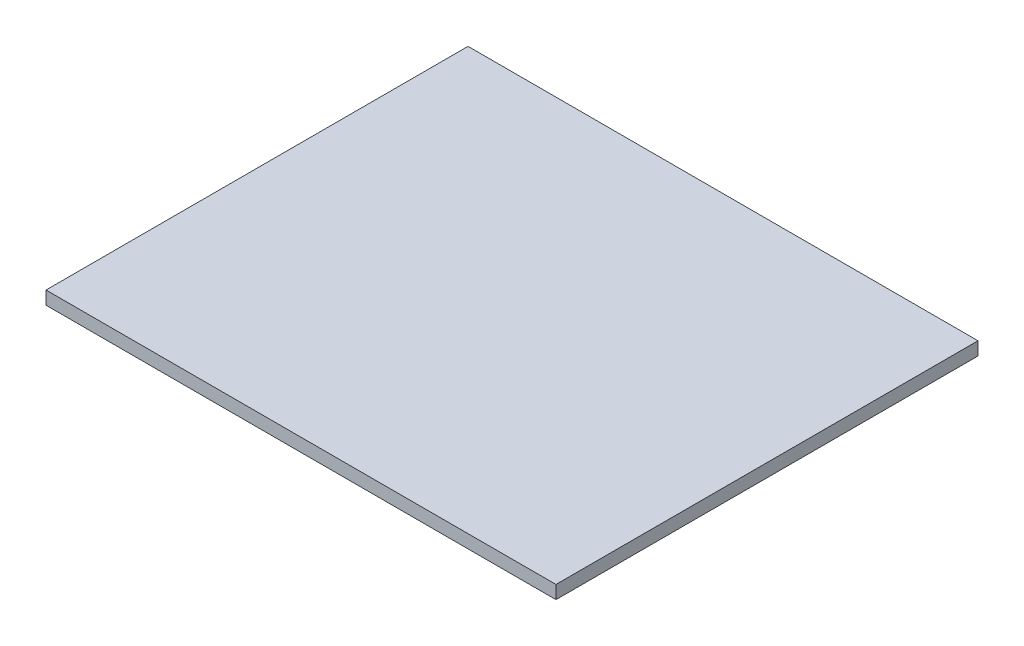
ISO-10303-21;
HEADER;
FILE_DESCRIPTION(('STEP AP214'),'2;1');
FILE_NAME('part.step','',(''),(''),'','','');
FILE_SCHEMA(('AUTOMOTIVE_DESIGN { 1 0 10303 214 1 1 1 1 }'));
ENDSEC;
DATA;
#1=APPLICATION_CONTEXT('core data for automotive mechanical design processes');
#2=APPLICATION_PROTOCOL_DEFINITION('international standard','automotive_design',2000,#1);
#3=PRODUCT_CONTEXT('',#1,'mechanical');
#4=PRODUCT('Part','Part','',(#3));
#5=PRODUCT_RELATED_PRODUCT_CATEGORY('part','',(#4));
#6=PRODUCT_DEFINITION_FORMATION('','',#4);
#7=PRODUCT_DEFINITION_CONTEXT('part definition',#1,'design');
#8=PRODUCT_DEFINITION('design','',#6,#7);
#9=PRODUCT_DEFINITION_SHAPE('','',#8);
#10=(LENGTH_UNIT() NAMED_UNIT(*) SI_UNIT(.MILLI.,.METRE.));
#11=(NAMED_UNIT(*) PLANE_ANGLE_UNIT() SI_UNIT($,.RADIAN.));
#12=(NAMED_UNIT(*) SI_UNIT($,.STERADIAN.) SOLID_ANGLE_UNIT());
#13=UNCERTAINTY_MEASURE_WITH_UNIT(LENGTH_MEASURE(1.E-05),#10,'distance_accuracy_value','');
#14=(GEOMETRIC_REPRESENTATION_CONTEXT(3) GLOBAL_UNCERTAINTY_ASSIGNED_CONTEXT((#13)) GLOBAL_UNIT_ASSIGNED_CONTEXT((#10,
#11,#12)) REPRESENTATION_CONTEXT('',''));
#15=CARTESIAN_POINT('',(0.,0.,0.));
#16=DIRECTION('',(0.,0.,1.));
#17=DIRECTION('',(1.,0.,0.));
#18=AXIS2_PLACEMENT_3D('',#15,#16,#17);
#19=CARTESIAN_POINT('',(0.,19.05,0.));
#20=DIRECTION('',(0.,0.,-1.));
#21=DIRECTION('',(-1.,0.,0.));
#22=AXIS2_PLACEMENT_3D('',#19,#20,#21);
#23=PLANE('',#22);
#24=DIRECTION('',(1.,0.,0.));
#25=VECTOR('',#24,1.);
#26=CARTESIAN_POINT('',(0.,0.,0.));
#27=LINE('',#26,#25);
#28=CARTESIAN_POINT('',(0.,0.,0.));
#29=VERTEX_POINT('',#28);
#30=CARTESIAN_POINT('',(736.6,0.,0.));
#31=VERTEX_POINT('',#30);
#32=EDGE_CURVE('E96',#29,#31,#27,.T.);
#33=ORIENTED_EDGE('',*,*,#32,.T.);
#34=DIRECTION('',(0.,-1.,0.));
#35=VECTOR('',#34,1.);
#36=CARTESIAN_POINT('',(736.6,19.05,0.));
#37=LINE('',#36,#35);
#38=CARTESIAN_POINT('',(736.6,19.05,0.));
#39=VERTEX_POINT('',#38);
#40=EDGE_CURVE('E11',#39,#31,#37,.T.);
#41=ORIENTED_EDGE('',*,*,#40,.F.);
#42=DIRECTION('',(1.,0.,0.));
#43=VECTOR('',#42,1.);
#44=CARTESIAN_POINT('',(0.,19.05,0.));
#45=LINE('',#44,#43);
#46=CARTESIAN_POINT('',(0.,19.05,0.));
#47=VERTEX_POINT('',#46);
#48=EDGE_CURVE('E82',#47,#39,#45,.T.);
#49=ORIENTED_EDGE('',*,*,#48,.F.);
#50=DIRECTION('',(0.,-1.,0.));
#51=VECTOR('',#50,1.);
#52=CARTESIAN_POINT('',(0.,19.05,0.));
#53=LINE('',#52,#51);
#54=EDGE_CURVE('E49',#47,#29,#53,.T.);
#55=ORIENTED_EDGE('',*,*,#54,.T.);
#56=EDGE_LOOP('',(#33,#41,#49,#55));
#57=FACE_BOUND('',#56,.T.);
#58=ADVANCED_FACE('F33',(#57),#23,.F.);
#59=CARTESIAN_POINT('',(736.6,19.05,0.));
#60=DIRECTION('',(-1.,0.,0.));
#61=DIRECTION('',(0.,0.,1.));
#62=AXIS2_PLACEMENT_3D('',#59,#60,#61);
#63=PLANE('',#62);
#64=DIRECTION('',(0.,0.,-1.));
#65=VECTOR('',#64,1.);
#66=CARTESIAN_POINT('',(736.6,0.,0.));
#67=LINE('',#66,#65);
#68=CARTESIAN_POINT('',(736.6,0.,-609.6));
#69=VERTEX_POINT('',#68);
#70=EDGE_CURVE('E87',#31,#69,#67,.T.);
#71=ORIENTED_EDGE('',*,*,#70,.T.);
#72=DIRECTION('',(0.,-1.,0.));
#73=VECTOR('',#72,1.);
#74=CARTESIAN_POINT('',(736.6,19.05,-609.6));
#75=LINE('',#74,#73);
#76=CARTESIAN_POINT('',(736.6,19.05,-609.6));
#77=VERTEX_POINT('',#76);
#78=EDGE_CURVE('E41',#77,#69,#75,.T.);
#79=ORIENTED_EDGE('',*,*,#78,.F.);
#80=DIRECTION('',(0.,0.,-1.));
#81=VECTOR('',#80,1.);
#82=CARTESIAN_POINT('',(736.6,19.05,0.));
#83=LINE('',#82,#81);
#84=EDGE_CURVE('E74',#39,#77,#83,.T.);
#85=ORIENTED_EDGE('',*,*,#84,.F.);
#86=ORIENTED_EDGE('',*,*,#40,.T.);
#87=EDGE_LOOP('',(#71,#79,#85,#86));
#88=FACE_BOUND('',#87,.T.);
#89=ADVANCED_FACE('F86',(#88),#63,.F.);
#90=CARTESIAN_POINT('',(0.,19.05,-609.6));
#91=DIRECTION('',(0.,0.,-1.));
#92=DIRECTION('',(-1.,0.,0.));
#93=AXIS2_PLACEMENT_3D('',#90,#91,#92);
#94=PLANE('',#93);
#95=DIRECTION('',(1.,0.,0.));
#96=VECTOR('',#95,1.);
#97=CARTESIAN_POINT('',(0.,0.,-609.6));
#98=LINE('',#97,#96);
#99=CARTESIAN_POINT('',(0.,0.,-609.6));
#100=VERTEX_POINT('',#99);
#101=EDGE_CURVE('E99',#100,#69,#98,.T.);
#102=ORIENTED_EDGE('',*,*,#101,.F.);
#103=DIRECTION('',(0.,-1.,0.));
#104=VECTOR('',#103,1.);
#105=CARTESIAN_POINT('',(0.,19.05,-609.6));
#106=LINE('',#105,#104);
#107=CARTESIAN_POINT('',(0.,19.05,-609.6));
#108=VERTEX_POINT('',#107);
#109=EDGE_CURVE('E63',#108,#100,#106,.T.);
#110=ORIENTED_EDGE('',*,*,#109,.F.);
#111=DIRECTION('',(1.,0.,0.));
#112=VECTOR('',#111,1.);
#113=CARTESIAN_POINT('',(0.,19.05,-609.6));
#114=LINE('',#113,#112);
#115=EDGE_CURVE('E81',#108,#77,#114,.T.);
#116=ORIENTED_EDGE('',*,*,#115,.T.);
#117=ORIENTED_EDGE('',*,*,#78,.T.);
#118=EDGE_LOOP('',(#102,#110,#116,#117));
#119=FACE_BOUND('',#118,.T.);
#120=ADVANCED_FACE('F90',(#119),#94,.T.);
#121=CARTESIAN_POINT('',(0.,19.05,0.));
#122=DIRECTION('',(-1.,0.,0.));
#123=DIRECTION('',(0.,0.,1.));
#124=AXIS2_PLACEMENT_3D('',#121,#122,#123);
#125=PLANE('',#124);
#126=DIRECTION('',(0.,0.,-1.));
#127=VECTOR('',#126,1.);
#128=CARTESIAN_POINT('',(0.,0.,0.));
#129=LINE('',#128,#127);
#130=EDGE_CURVE('E101',#29,#100,#129,.T.);
#131=ORIENTED_EDGE('',*,*,#130,.F.);
#132=ORIENTED_EDGE('',*,*,#54,.F.);
#133=DIRECTION('',(0.,0.,-1.));
#134=VECTOR('',#133,1.);
#135=CARTESIAN_POINT('',(0.,19.05,0.));
#136=LINE('',#135,#134);
#137=EDGE_CURVE('E91',#47,#108,#136,.T.);
#138=ORIENTED_EDGE('',*,*,#137,.T.);
#139=ORIENTED_EDGE('',*,*,#109,.T.);
#140=EDGE_LOOP('',(#131,#132,#138,#139));
#141=FACE_BOUND('',#140,.T.);
#142=ADVANCED_FACE('F107',(#141),#125,.T.);
#143=CARTESIAN_POINT('',(0.,19.05,0.));
#144=DIRECTION('',(0.,1.,0.));
#145=DIRECTION('',(0.,0.,1.));
#146=AXIS2_PLACEMENT_3D('',#143,#144,#145);
#147=PLANE('',#146);
#148=ORIENTED_EDGE('',*,*,#48,.T.);
#149=ORIENTED_EDGE('',*,*,#84,.T.);
#150=ORIENTED_EDGE('',*,*,#115,.F.);
#151=ORIENTED_EDGE('',*,*,#137,.F.);
#152=EDGE_LOOP('',(#148,#149,#150,#151));
#153=FACE_BOUND('',#152,.T.);
#154=ADVANCED_FACE('F78',(#153),#147,.T.);
#155=CARTESIAN_POINT('',(0.,0.,0.));
#156=DIRECTION('',(0.,1.,0.));
#157=DIRECTION('',(0.,0.,1.));
#158=AXIS2_PLACEMENT_3D('',#155,#156,#157);
#159=PLANE('',#158);
#160=ORIENTED_EDGE('',*,*,#32,.F.);
#161=ORIENTED_EDGE('',*,*,#130,.T.);
#162=ORIENTED_EDGE('',*,*,#101,.T.);
#163=ORIENTED_EDGE('',*,*,#70,.F.);
#164=EDGE_LOOP('',(#160,#161,#162,#163));
#165=FACE_BOUND('',#164,.T.);
#166=ADVANCED_FACE('F106',(#165),#159,.F.);
#167=CLOSED_SHELL('',(#58,#89,#120,#142,#154,#166));
#168=MANIFOLD_SOLID_BREP('B2',#167);
#169=ADVANCED_BREP_SHAPE_REPRESENTATION('',(#18,#168),#14);
#170=SHAPE_DEFINITION_REPRESENTATION(#9,#169);
ENDSEC;
END-ISO-10303-21;
